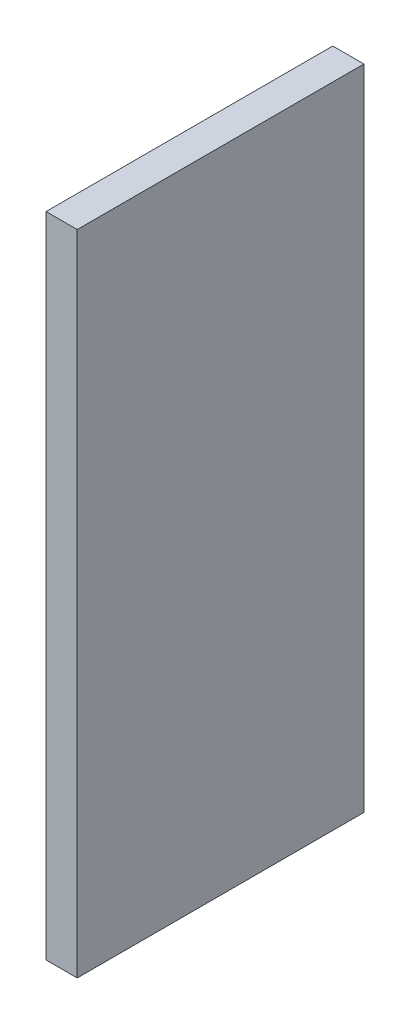
ISO-10303-21;
HEADER;
FILE_DESCRIPTION(('STEP AP214'),'2;1');
FILE_NAME('part.step','',(''),(''),'','','');
FILE_SCHEMA(('AUTOMOTIVE_DESIGN { 1 0 10303 214 1 1 1 1 }'));
ENDSEC;
DATA;
#1=APPLICATION_CONTEXT('core data for automotive mechanical design processes');
#2=APPLICATION_PROTOCOL_DEFINITION('international standard','automotive_design',2000,#1);
#3=PRODUCT_CONTEXT('',#1,'mechanical');
#4=PRODUCT('Part','Part','',(#3));
#5=PRODUCT_RELATED_PRODUCT_CATEGORY('part','',(#4));
#6=PRODUCT_DEFINITION_FORMATION('','',#4);
#7=PRODUCT_DEFINITION_CONTEXT('part definition',#1,'design');
#8=PRODUCT_DEFINITION('design','',#6,#7);
#9=PRODUCT_DEFINITION_SHAPE('','',#8);
#10=(LENGTH_UNIT() NAMED_UNIT(*) SI_UNIT(.MILLI.,.METRE.));
#11=(NAMED_UNIT(*) PLANE_ANGLE_UNIT() SI_UNIT($,.RADIAN.));
#12=(NAMED_UNIT(*) SI_UNIT($,.STERADIAN.) SOLID_ANGLE_UNIT());
#13=UNCERTAINTY_MEASURE_WITH_UNIT(LENGTH_MEASURE(1.E-05),#10,'distance_accuracy_value','');
#14=(GEOMETRIC_REPRESENTATION_CONTEXT(3) GLOBAL_UNCERTAINTY_ASSIGNED_CONTEXT((#13)) GLOBAL_UNIT_ASSIGNED_CONTEXT((#10,
#11,#12)) REPRESENTATION_CONTEXT('',''));
#15=CARTESIAN_POINT('',(0.,0.,0.));
#16=DIRECTION('',(0.,0.,1.));
#17=DIRECTION('',(1.,0.,0.));
#18=AXIS2_PLACEMENT_3D('',#15,#16,#17);
#19=CARTESIAN_POINT('',(-1.25,26.,23.));
#20=DIRECTION('',(1.,0.,0.));
#21=DIRECTION('',(0.,0.,-1.));
#22=AXIS2_PLACEMENT_3D('',#19,#20,#21);
#23=PLANE('',#22);
#24=DIRECTION('',(0.,-1.,0.));
#25=VECTOR('',#24,1.);
#26=CARTESIAN_POINT('',(-1.25,26.,0.));
#27=LINE('',#26,#25);
#28=CARTESIAN_POINT('',(-1.25,26.,0.));
#29=VERTEX_POINT('',#28);
#30=CARTESIAN_POINT('',(-1.25,-26.,0.));
#31=VERTEX_POINT('',#30);
#32=EDGE_CURVE('E96',#29,#31,#27,.T.);
#33=ORIENTED_EDGE('',*,*,#32,.T.);
#34=DIRECTION('',(0.,0.,-1.));
#35=VECTOR('',#34,1.);
#36=CARTESIAN_POINT('',(-1.25,-26.,23.));
#37=LINE('',#36,#35);
#38=CARTESIAN_POINT('',(-1.25,-26.,23.));
#39=VERTEX_POINT('',#38);
#40=EDGE_CURVE('E11',#39,#31,#37,.T.);
#41=ORIENTED_EDGE('',*,*,#40,.F.);
#42=DIRECTION('',(0.,-1.,0.));
#43=VECTOR('',#42,1.);
#44=CARTESIAN_POINT('',(-1.25,26.,23.));
#45=LINE('',#44,#43);
#46=CARTESIAN_POINT('',(-1.25,26.,23.));
#47=VERTEX_POINT('',#46);
#48=EDGE_CURVE('E84',#47,#39,#45,.T.);
#49=ORIENTED_EDGE('',*,*,#48,.F.);
#50=DIRECTION('',(0.,0.,-1.));
#51=VECTOR('',#50,1.);
#52=CARTESIAN_POINT('',(-1.25,26.,23.));
#53=LINE('',#52,#51);
#54=EDGE_CURVE('E92',#47,#29,#53,.T.);
#55=ORIENTED_EDGE('',*,*,#54,.T.);
#56=EDGE_LOOP('',(#33,#41,#49,#55));
#57=FACE_BOUND('',#56,.T.);
#58=ADVANCED_FACE('F33',(#57),#23,.F.);
#59=CARTESIAN_POINT('',(-1.25,-26.,23.));
#60=DIRECTION('',(0.,1.,0.));
#61=DIRECTION('',(0.,0.,1.));
#62=AXIS2_PLACEMENT_3D('',#59,#60,#61);
#63=PLANE('',#62);
#64=DIRECTION('',(1.,0.,0.));
#65=VECTOR('',#64,1.);
#66=CARTESIAN_POINT('',(-1.25,-26.,0.));
#67=LINE('',#66,#65);
#68=CARTESIAN_POINT('',(1.25,-26.,0.));
#69=VERTEX_POINT('',#68);
#70=EDGE_CURVE('E88',#31,#69,#67,.T.);
#71=ORIENTED_EDGE('',*,*,#70,.T.);
#72=DIRECTION('',(0.,0.,-1.));
#73=VECTOR('',#72,1.);
#74=CARTESIAN_POINT('',(1.25,-26.,23.));
#75=LINE('',#74,#73);
#76=CARTESIAN_POINT('',(1.25,-26.,23.));
#77=VERTEX_POINT('',#76);
#78=EDGE_CURVE('E41',#77,#69,#75,.T.);
#79=ORIENTED_EDGE('',*,*,#78,.F.);
#80=DIRECTION('',(1.,0.,0.));
#81=VECTOR('',#80,1.);
#82=CARTESIAN_POINT('',(-1.25,-26.,23.));
#83=LINE('',#82,#81);
#84=EDGE_CURVE('E79',#39,#77,#83,.T.);
#85=ORIENTED_EDGE('',*,*,#84,.F.);
#86=ORIENTED_EDGE('',*,*,#40,.T.);
#87=EDGE_LOOP('',(#71,#79,#85,#86));
#88=FACE_BOUND('',#87,.T.);
#89=ADVANCED_FACE('F87',(#88),#63,.F.);
#90=CARTESIAN_POINT('',(1.25,-26.,23.));
#91=DIRECTION('',(-1.,0.,0.));
#92=DIRECTION('',(0.,0.,1.));
#93=AXIS2_PLACEMENT_3D('',#90,#91,#92);
#94=PLANE('',#93);
#95=DIRECTION('',(0.,1.,0.));
#96=VECTOR('',#95,1.);
#97=CARTESIAN_POINT('',(1.25,-26.,0.));
#98=LINE('',#97,#96);
#99=CARTESIAN_POINT('',(1.25,26.,0.));
#100=VERTEX_POINT('',#99);
#101=EDGE_CURVE('E66',#69,#100,#98,.T.);
#102=ORIENTED_EDGE('',*,*,#101,.T.);
#103=DIRECTION('',(0.,0.,-1.));
#104=VECTOR('',#103,1.);
#105=CARTESIAN_POINT('',(1.25,26.,23.));
#106=LINE('',#105,#104);
#107=CARTESIAN_POINT('',(1.25,26.,23.));
#108=VERTEX_POINT('',#107);
#109=EDGE_CURVE('E89',#108,#100,#106,.T.);
#110=ORIENTED_EDGE('',*,*,#109,.F.);
#111=DIRECTION('',(0.,1.,0.));
#112=VECTOR('',#111,1.);
#113=CARTESIAN_POINT('',(1.25,-26.,23.));
#114=LINE('',#113,#112);
#115=EDGE_CURVE('E82',#77,#108,#114,.T.);
#116=ORIENTED_EDGE('',*,*,#115,.F.);
#117=ORIENTED_EDGE('',*,*,#78,.T.);
#118=EDGE_LOOP('',(#102,#110,#116,#117));
#119=FACE_BOUND('',#118,.T.);
#120=ADVANCED_FACE('F90',(#119),#94,.F.);
#121=CARTESIAN_POINT('',(1.25,26.,23.));
#122=DIRECTION('',(0.,-1.,0.));
#123=DIRECTION('',(0.,0.,-1.));
#124=AXIS2_PLACEMENT_3D('',#121,#122,#123);
#125=PLANE('',#124);
#126=DIRECTION('',(-1.,0.,0.));
#127=VECTOR('',#126,1.);
#128=CARTESIAN_POINT('',(1.25,26.,0.));
#129=LINE('',#128,#127);
#130=EDGE_CURVE('E72',#100,#29,#129,.T.);
#131=ORIENTED_EDGE('',*,*,#130,.T.);
#132=ORIENTED_EDGE('',*,*,#54,.F.);
#133=DIRECTION('',(-1.,0.,0.));
#134=VECTOR('',#133,1.);
#135=CARTESIAN_POINT('',(1.25,26.,23.));
#136=LINE('',#135,#134);
#137=EDGE_CURVE('E49',#108,#47,#136,.T.);
#138=ORIENTED_EDGE('',*,*,#137,.F.);
#139=ORIENTED_EDGE('',*,*,#109,.T.);
#140=EDGE_LOOP('',(#131,#132,#138,#139));
#141=FACE_BOUND('',#140,.T.);
#142=ADVANCED_FACE('F103',(#141),#125,.F.);
#143=CARTESIAN_POINT('',(0.,0.,23.));
#144=DIRECTION('',(0.,0.,1.));
#145=DIRECTION('',(1.,0.,0.));
#146=AXIS2_PLACEMENT_3D('',#143,#144,#145);
#147=PLANE('',#146);
#148=ORIENTED_EDGE('',*,*,#48,.T.);
#149=ORIENTED_EDGE('',*,*,#84,.T.);
#150=ORIENTED_EDGE('',*,*,#115,.T.);
#151=ORIENTED_EDGE('',*,*,#137,.T.);
#152=EDGE_LOOP('',(#148,#149,#150,#151));
#153=FACE_BOUND('',#152,.T.);
#154=ADVANCED_FACE('F80',(#153),#147,.T.);
#155=CARTESIAN_POINT('',(0.,0.,0.));
#156=DIRECTION('',(0.,0.,1.));
#157=DIRECTION('',(1.,0.,0.));
#158=AXIS2_PLACEMENT_3D('',#155,#156,#157);
#159=PLANE('',#158);
#160=ORIENTED_EDGE('',*,*,#32,.F.);
#161=ORIENTED_EDGE('',*,*,#130,.F.);
#162=ORIENTED_EDGE('',*,*,#101,.F.);
#163=ORIENTED_EDGE('',*,*,#70,.F.);
#164=EDGE_LOOP('',(#160,#161,#162,#163));
#165=FACE_BOUND('',#164,.T.);
#166=ADVANCED_FACE('F106',(#165),#159,.F.);
#167=CLOSED_SHELL('',(#58,#89,#120,#142,#154,#166));
#168=MANIFOLD_SOLID_BREP('B2',#167);
#169=ADVANCED_BREP_SHAPE_REPRESENTATION('',(#18,#168),#14);
#170=SHAPE_DEFINITION_REPRESENTATION(#9,#169);
ENDSEC;
END-ISO-10303-21;
